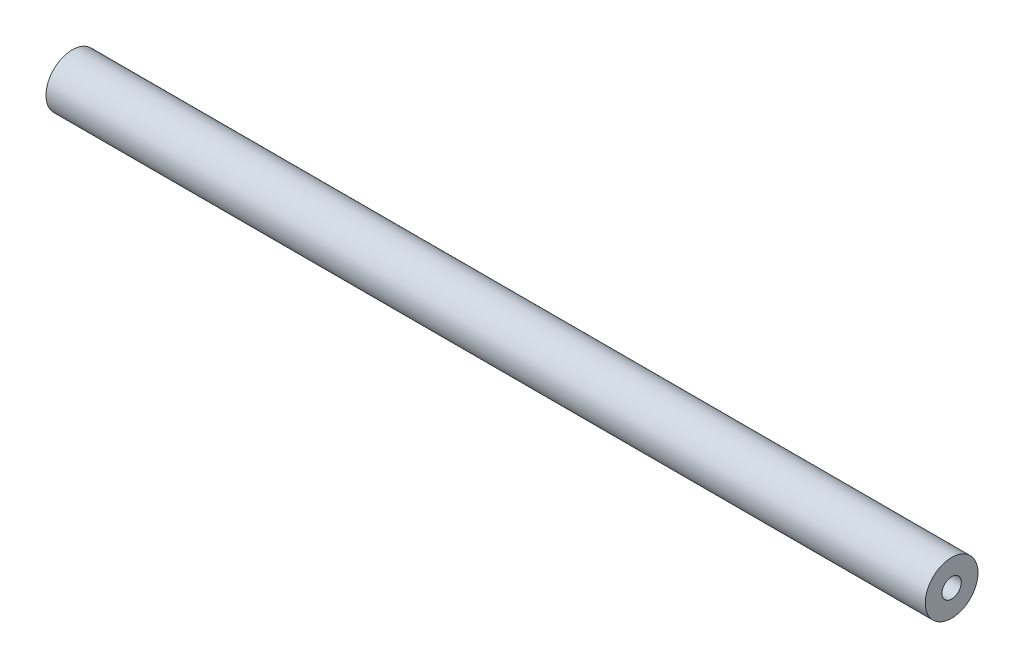
ISO-10303-21;
HEADER;
FILE_DESCRIPTION(('STEP AP214'),'2;1');
FILE_NAME('part.step','',(''),(''),'','','');
FILE_SCHEMA(('AUTOMOTIVE_DESIGN { 1 0 10303 214 1 1 1 1 }'));
ENDSEC;
DATA;
#1=APPLICATION_CONTEXT('core data for automotive mechanical design processes');
#2=APPLICATION_PROTOCOL_DEFINITION('international standard','automotive_design',2000,#1);
#3=PRODUCT_CONTEXT('',#1,'mechanical');
#4=PRODUCT('Part','Part','',(#3));
#5=PRODUCT_RELATED_PRODUCT_CATEGORY('part','',(#4));
#6=PRODUCT_DEFINITION_FORMATION('','',#4);
#7=PRODUCT_DEFINITION_CONTEXT('part definition',#1,'design');
#8=PRODUCT_DEFINITION('design','',#6,#7);
#9=PRODUCT_DEFINITION_SHAPE('','',#8);
#10=(LENGTH_UNIT() NAMED_UNIT(*) SI_UNIT(.MILLI.,.METRE.));
#11=(NAMED_UNIT(*) PLANE_ANGLE_UNIT() SI_UNIT($,.RADIAN.));
#12=(NAMED_UNIT(*) SI_UNIT($,.STERADIAN.) SOLID_ANGLE_UNIT());
#13=UNCERTAINTY_MEASURE_WITH_UNIT(LENGTH_MEASURE(1.E-05),#10,'distance_accuracy_value','');
#14=(GEOMETRIC_REPRESENTATION_CONTEXT(3) GLOBAL_UNCERTAINTY_ASSIGNED_CONTEXT((#13)) GLOBAL_UNIT_ASSIGNED_CONTEXT((#10,
#11,#12)) REPRESENTATION_CONTEXT('',''));
#15=CARTESIAN_POINT('',(0.,0.,0.));
#16=DIRECTION('',(0.,0.,1.));
#17=DIRECTION('',(1.,0.,0.));
#18=AXIS2_PLACEMENT_3D('',#15,#16,#17);
#19=CARTESIAN_POINT('',(150.,0.,0.));
#20=DIRECTION('',(1.,0.,0.));
#21=DIRECTION('',(0.,0.,-1.));
#22=AXIS2_PLACEMENT_3D('',#19,#20,#21);
#23=PLANE('',#22);
#24=CARTESIAN_POINT('',(150.,0.,0.));
#25=DIRECTION('',(1.,0.,0.));
#26=DIRECTION('',(0.,0.,-1.));
#27=AXIS2_PLACEMENT_3D('',#24,#25,#26);
#28=CIRCLE('',#27,4.5);
#29=CARTESIAN_POINT('',(150.,0.,-4.5));
#30=VERTEX_POINT('',#29);
#31=EDGE_CURVE('E10',#30,#30,#28,.T.);
#32=ORIENTED_EDGE('',*,*,#31,.T.);
#33=EDGE_LOOP('',(#32));
#34=FACE_BOUND('',#33,.T.);
#35=CARTESIAN_POINT('',(150.,0.,0.));
#36=DIRECTION('',(1.,0.,0.));
#37=DIRECTION('',(0.,0.,-1.));
#38=AXIS2_PLACEMENT_3D('',#35,#36,#37);
#39=CIRCLE('',#38,1.65);
#40=CARTESIAN_POINT('',(150.,0.,-1.65));
#41=VERTEX_POINT('',#40);
#42=EDGE_CURVE('E52',#41,#41,#39,.T.);
#43=ORIENTED_EDGE('',*,*,#42,.F.);
#44=EDGE_LOOP('',(#43));
#45=FACE_BOUND('',#44,.T.);
#46=ADVANCED_FACE('F41',(#34,#45),#23,.T.);
#47=CARTESIAN_POINT('',(0.,0.,0.));
#48=DIRECTION('',(1.,0.,0.));
#49=DIRECTION('',(0.,0.,-1.));
#50=AXIS2_PLACEMENT_3D('',#47,#48,#49);
#51=PLANE('',#50);
#52=CARTESIAN_POINT('',(0.,0.,0.));
#53=DIRECTION('',(1.,0.,0.));
#54=DIRECTION('',(0.,0.,-1.));
#55=AXIS2_PLACEMENT_3D('',#52,#53,#54);
#56=CIRCLE('',#55,4.5);
#57=CARTESIAN_POINT('',(0.,0.,-4.5));
#58=VERTEX_POINT('',#57);
#59=EDGE_CURVE('E45',#58,#58,#56,.T.);
#60=ORIENTED_EDGE('',*,*,#59,.F.);
#61=EDGE_LOOP('',(#60));
#62=FACE_BOUND('',#61,.T.);
#63=CARTESIAN_POINT('',(0.,0.,0.));
#64=DIRECTION('',(1.,0.,0.));
#65=DIRECTION('',(0.,0.,-1.));
#66=AXIS2_PLACEMENT_3D('',#63,#64,#65);
#67=CIRCLE('',#66,1.65);
#68=CARTESIAN_POINT('',(0.,0.,-1.65));
#69=VERTEX_POINT('',#68);
#70=EDGE_CURVE('E54',#69,#69,#67,.T.);
#71=ORIENTED_EDGE('',*,*,#70,.T.);
#72=EDGE_LOOP('',(#71));
#73=FACE_BOUND('',#72,.T.);
#74=ADVANCED_FACE('F64',(#62,#73),#51,.F.);
#75=CARTESIAN_POINT('',(150.,0.,0.));
#76=DIRECTION('',(-1.,0.,0.));
#77=DIRECTION('',(0.,0.,1.));
#78=AXIS2_PLACEMENT_3D('',#75,#76,#77);
#79=CYLINDRICAL_SURFACE('',#78,4.5);
#80=ORIENTED_EDGE('',*,*,#31,.F.);
#81=EDGE_LOOP('',(#80));
#82=FACE_BOUND('',#81,.T.);
#83=ORIENTED_EDGE('',*,*,#59,.T.);
#84=EDGE_LOOP('',(#83));
#85=FACE_BOUND('',#84,.T.);
#86=ADVANCED_FACE('F43',(#82,#85),#79,.T.);
#87=CARTESIAN_POINT('',(150.,0.,0.));
#88=DIRECTION('',(-1.,0.,0.));
#89=DIRECTION('',(0.,0.,1.));
#90=AXIS2_PLACEMENT_3D('',#87,#88,#89);
#91=CYLINDRICAL_SURFACE('',#90,1.65);
#92=ORIENTED_EDGE('',*,*,#42,.T.);
#93=EDGE_LOOP('',(#92));
#94=FACE_BOUND('',#93,.T.);
#95=ORIENTED_EDGE('',*,*,#70,.F.);
#96=EDGE_LOOP('',(#95));
#97=FACE_BOUND('',#96,.T.);
#98=ADVANCED_FACE('F60',(#94,#97),#91,.F.);
#99=CLOSED_SHELL('',(#46,#74,#86,#98));
#100=MANIFOLD_SOLID_BREP('B2',#99);
#101=ADVANCED_BREP_SHAPE_REPRESENTATION('',(#18,#100),#14);
#102=SHAPE_DEFINITION_REPRESENTATION(#9,#101);
ENDSEC;
END-ISO-10303-21;
